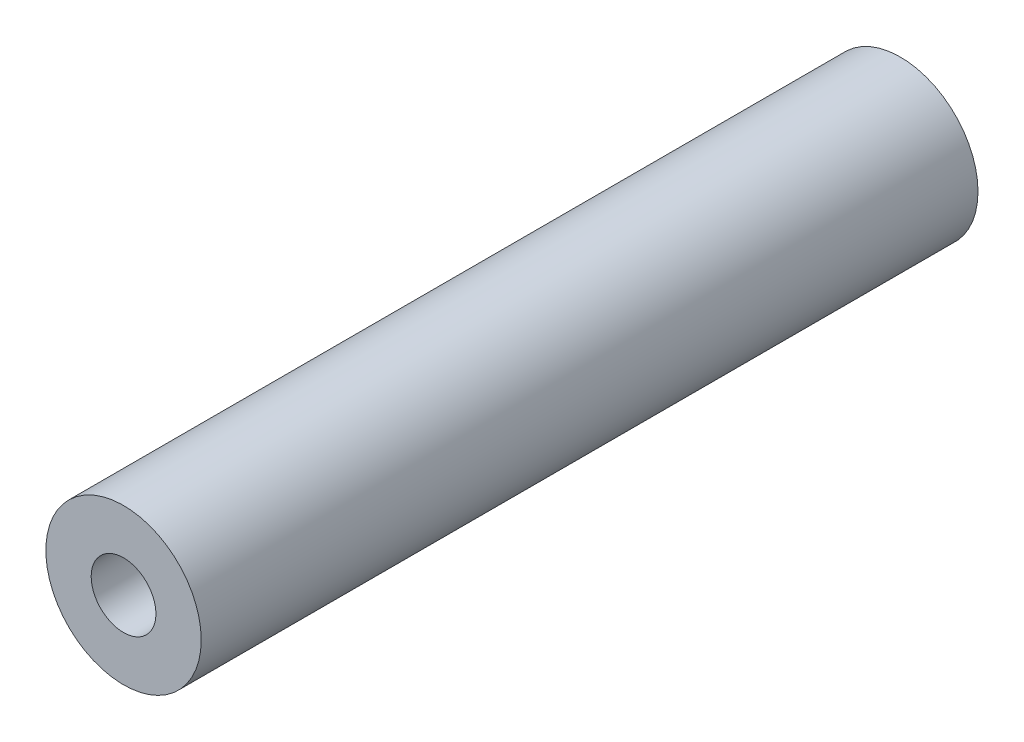
ISO-10303-21;
HEADER;
FILE_DESCRIPTION(('STEP AP214'),'2;1');
FILE_NAME('part.step','',(''),(''),'','','');
FILE_SCHEMA(('AUTOMOTIVE_DESIGN { 1 0 10303 214 1 1 1 1 }'));
ENDSEC;
DATA;
#1=APPLICATION_CONTEXT('core data for automotive mechanical design processes');
#2=APPLICATION_PROTOCOL_DEFINITION('international standard','automotive_design',2000,#1);
#3=PRODUCT_CONTEXT('',#1,'mechanical');
#4=PRODUCT('Part','Part','',(#3));
#5=PRODUCT_RELATED_PRODUCT_CATEGORY('part','',(#4));
#6=PRODUCT_DEFINITION_FORMATION('','',#4);
#7=PRODUCT_DEFINITION_CONTEXT('part definition',#1,'design');
#8=PRODUCT_DEFINITION('design','',#6,#7);
#9=PRODUCT_DEFINITION_SHAPE('','',#8);
#10=(LENGTH_UNIT() NAMED_UNIT(*) SI_UNIT(.MILLI.,.METRE.));
#11=(NAMED_UNIT(*) PLANE_ANGLE_UNIT() SI_UNIT($,.RADIAN.));
#12=(NAMED_UNIT(*) SI_UNIT($,.STERADIAN.) SOLID_ANGLE_UNIT());
#13=UNCERTAINTY_MEASURE_WITH_UNIT(LENGTH_MEASURE(1.E-05),#10,'distance_accuracy_value','');
#14=(GEOMETRIC_REPRESENTATION_CONTEXT(3) GLOBAL_UNCERTAINTY_ASSIGNED_CONTEXT((#13)) GLOBAL_UNIT_ASSIGNED_CONTEXT((#10,
#11,#12)) REPRESENTATION_CONTEXT('',''));
#15=CARTESIAN_POINT('',(0.,0.,0.));
#16=DIRECTION('',(0.,0.,1.));
#17=DIRECTION('',(1.,0.,0.));
#18=AXIS2_PLACEMENT_3D('',#15,#16,#17);
#19=CARTESIAN_POINT('',(-81.5980762113509,714.4426835522,-381.357743681072));
#20=DIRECTION('',(0.,0.,-1.));
#21=DIRECTION('',(-1.,0.,0.));
#22=AXIS2_PLACEMENT_3D('',#19,#20,#21);
#23=PLANE('',#22);
#24=CARTESIAN_POINT('',(-81.5980762113509,714.4426835522,-381.357743681072));
#25=DIRECTION('',(0.,0.,-1.));
#26=DIRECTION('',(-1.,0.,0.));
#27=AXIS2_PLACEMENT_3D('',#24,#25,#26);
#28=CIRCLE('',#27,1.25);
#29=CARTESIAN_POINT('',(-82.8480762113509,714.4426835522,-381.357743681072));
#30=VERTEX_POINT('',#29);
#31=EDGE_CURVE('E18',#30,#30,#28,.F.);
#32=ORIENTED_EDGE('',*,*,#31,.T.);
#33=EDGE_LOOP('',(#32));
#34=FACE_BOUND('',#33,.T.);
#35=ADVANCED_FACE('F15',(#34),#23,.F.);
#36=CARTESIAN_POINT('',(-81.5980762113504,714.442683552201,-391.357743681072));
#37=DIRECTION('',(0.,0.,1.));
#38=DIRECTION('',(1.,0.,0.));
#39=AXIS2_PLACEMENT_3D('',#36,#37,#38);
#40=PLANE('',#39);
#41=CARTESIAN_POINT('',(-81.5980762113504,714.442683552201,-391.357743681072));
#42=DIRECTION('',(0.,0.,-1.));
#43=DIRECTION('',(-1.,0.,0.));
#44=AXIS2_PLACEMENT_3D('',#41,#42,#43);
#45=CIRCLE('',#44,1.25);
#46=CARTESIAN_POINT('',(-82.8480762113504,714.442683552201,-391.357743681072));
#47=VERTEX_POINT('',#46);
#48=EDGE_CURVE('E34',#47,#47,#45,.T.);
#49=ORIENTED_EDGE('',*,*,#48,.T.);
#50=EDGE_LOOP('',(#49));
#51=FACE_BOUND('',#50,.T.);
#52=ADVANCED_FACE('F45',(#51),#40,.F.);
#53=CARTESIAN_POINT('',(-81.5980762113509,714.4426835522,-376.357743681072));
#54=DIRECTION('',(0.,0.,-1.));
#55=DIRECTION('',(-1.,0.,0.));
#56=AXIS2_PLACEMENT_3D('',#53,#54,#55);
#57=CYLINDRICAL_SURFACE('',#56,1.25);
#58=CARTESIAN_POINT('',(-81.5980762113509,714.4426835522,-371.357743681072));
#59=DIRECTION('',(0.,0.,-1.));
#60=DIRECTION('',(-1.,0.,0.));
#61=AXIS2_PLACEMENT_3D('',#58,#59,#60);
#62=CIRCLE('',#61,1.25);
#63=CARTESIAN_POINT('',(-82.8480762113509,714.4426835522,-371.357743681072));
#64=VERTEX_POINT('',#63);
#65=EDGE_CURVE('E32',#64,#64,#62,.T.);
#66=ORIENTED_EDGE('',*,*,#65,.F.);
#67=EDGE_LOOP('',(#66));
#68=FACE_BOUND('',#67,.T.);
#69=ORIENTED_EDGE('',*,*,#31,.F.);
#70=EDGE_LOOP('',(#69));
#71=FACE_BOUND('',#70,.T.);
#72=ADVANCED_FACE('F42',(#68,#71),#57,.F.);
#73=CARTESIAN_POINT('',(-81.5980762113504,714.442683552201,-396.357743681072));
#74=DIRECTION('',(0.,0.,-1.));
#75=DIRECTION('',(-1.,0.,0.));
#76=AXIS2_PLACEMENT_3D('',#73,#74,#75);
#77=CYLINDRICAL_SURFACE('',#76,1.25);
#78=CARTESIAN_POINT('',(-81.5980762113504,714.442683552201,-401.357743681072));
#79=DIRECTION('',(0.,0.,-1.));
#80=DIRECTION('',(-1.,0.,0.));
#81=AXIS2_PLACEMENT_3D('',#78,#79,#80);
#82=CIRCLE('',#81,1.25);
#83=CARTESIAN_POINT('',(-82.8480762113504,714.442683552201,-401.357743681072));
#84=VERTEX_POINT('',#83);
#85=EDGE_CURVE('E27',#84,#84,#82,.F.);
#86=ORIENTED_EDGE('',*,*,#85,.F.);
#87=EDGE_LOOP('',(#86));
#88=FACE_BOUND('',#87,.T.);
#89=ORIENTED_EDGE('',*,*,#48,.F.);
#90=EDGE_LOOP('',(#89));
#91=FACE_BOUND('',#90,.T.);
#92=ADVANCED_FACE('F44',(#88,#91),#77,.F.);
#93=CARTESIAN_POINT('',(-81.5980762113504,714.442683552201,-371.357743681072));
#94=DIRECTION('',(0.,0.,1.));
#95=DIRECTION('',(1.,0.,0.));
#96=AXIS2_PLACEMENT_3D('',#93,#94,#95);
#97=PLANE('',#96);
#98=ORIENTED_EDGE('',*,*,#65,.T.);
#99=EDGE_LOOP('',(#98));
#100=FACE_BOUND('',#99,.T.);
#101=CARTESIAN_POINT('',(-81.5980762113504,714.442683552201,-371.357743681072));
#102=DIRECTION('',(0.,0.,1.));
#103=DIRECTION('',(1.,0.,0.));
#104=AXIS2_PLACEMENT_3D('',#101,#102,#103);
#105=CIRCLE('',#104,3.);
#106=CARTESIAN_POINT('',(-78.5980762113504,714.442683552201,-371.357743681072));
#107=VERTEX_POINT('',#106);
#108=EDGE_CURVE('E22',#107,#107,#105,.F.);
#109=ORIENTED_EDGE('',*,*,#108,.F.);
#110=EDGE_LOOP('',(#109));
#111=FACE_BOUND('',#110,.T.);
#112=ADVANCED_FACE('F53',(#100,#111),#97,.T.);
#113=CARTESIAN_POINT('',(-81.5980762113504,714.442683552201,-401.357743681072));
#114=DIRECTION('',(0.,0.,-1.));
#115=DIRECTION('',(-1.,0.,0.));
#116=AXIS2_PLACEMENT_3D('',#113,#114,#115);
#117=PLANE('',#116);
#118=ORIENTED_EDGE('',*,*,#85,.T.);
#119=EDGE_LOOP('',(#118));
#120=FACE_BOUND('',#119,.T.);
#121=CARTESIAN_POINT('',(-81.5980762113504,714.442683552201,-401.357743681072));
#122=DIRECTION('',(0.,0.,1.));
#123=DIRECTION('',(1.,0.,0.));
#124=AXIS2_PLACEMENT_3D('',#121,#122,#123);
#125=CIRCLE('',#124,3.);
#126=CARTESIAN_POINT('',(-78.5980762113504,714.442683552201,-401.357743681072));
#127=VERTEX_POINT('',#126);
#128=EDGE_CURVE('E10',#127,#127,#125,.T.);
#129=ORIENTED_EDGE('',*,*,#128,.F.);
#130=EDGE_LOOP('',(#129));
#131=FACE_BOUND('',#130,.T.);
#132=ADVANCED_FACE('F59',(#120,#131),#117,.T.);
#133=CARTESIAN_POINT('',(-81.5980762113504,714.442683552201,-386.357743681072));
#134=DIRECTION('',(0.,0.,1.));
#135=DIRECTION('',(1.,0.,0.));
#136=AXIS2_PLACEMENT_3D('',#133,#134,#135);
#137=CYLINDRICAL_SURFACE('',#136,3.);
#138=ORIENTED_EDGE('',*,*,#108,.T.);
#139=EDGE_LOOP('',(#138));
#140=FACE_BOUND('',#139,.T.);
#141=ORIENTED_EDGE('',*,*,#128,.T.);
#142=EDGE_LOOP('',(#141));
#143=FACE_BOUND('',#142,.T.);
#144=ADVANCED_FACE('F57',(#140,#143),#137,.T.);
#145=CLOSED_SHELL('',(#35,#52,#72,#92,#112,#132,#144));
#146=MANIFOLD_SOLID_BREP('B1',#145);
#147=ADVANCED_BREP_SHAPE_REPRESENTATION('',(#18,#146),#14);
#148=SHAPE_DEFINITION_REPRESENTATION(#9,#147);
ENDSEC;
END-ISO-10303-21;
